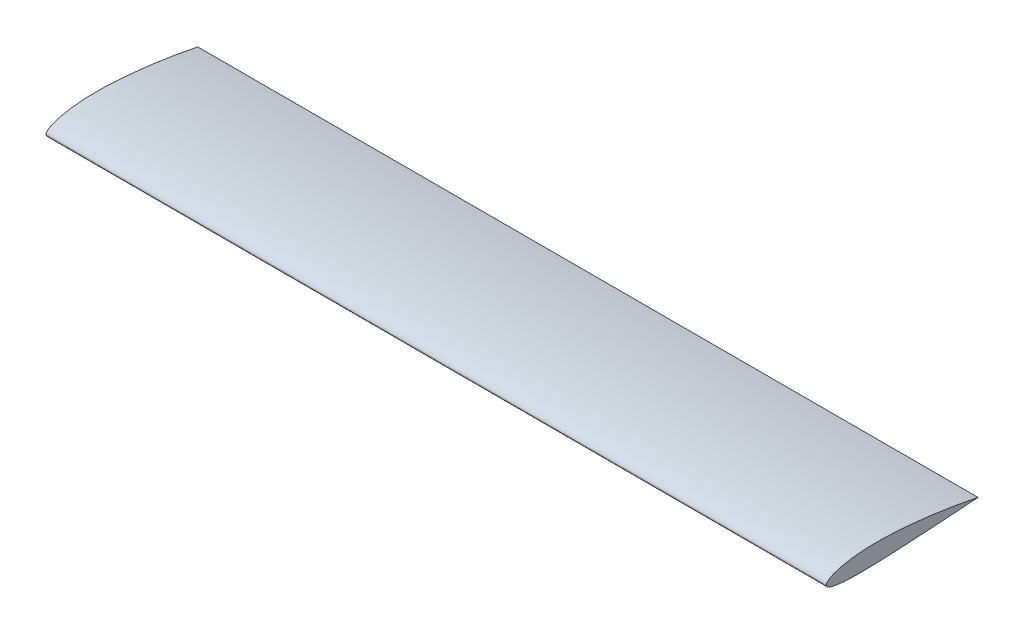
ISO-10303-21;
HEADER;
FILE_DESCRIPTION(('STEP AP214'),'2;1');
FILE_NAME('part.step','',(''),(''),'','','');
FILE_SCHEMA(('AUTOMOTIVE_DESIGN { 1 0 10303 214 1 1 1 1 }'));
ENDSEC;
DATA;
#1=APPLICATION_CONTEXT('core data for automotive mechanical design processes');
#2=APPLICATION_PROTOCOL_DEFINITION('international standard','automotive_design',2000,#1);
#3=PRODUCT_CONTEXT('',#1,'mechanical');
#4=PRODUCT('Part','Part','',(#3));
#5=PRODUCT_RELATED_PRODUCT_CATEGORY('part','',(#4));
#6=PRODUCT_DEFINITION_FORMATION('','',#4);
#7=PRODUCT_DEFINITION_CONTEXT('part definition',#1,'design');
#8=PRODUCT_DEFINITION('design','',#6,#7);
#9=PRODUCT_DEFINITION_SHAPE('','',#8);
#10=(LENGTH_UNIT() NAMED_UNIT(*) SI_UNIT(.MILLI.,.METRE.));
#11=(NAMED_UNIT(*) PLANE_ANGLE_UNIT() SI_UNIT($,.RADIAN.));
#12=(NAMED_UNIT(*) SI_UNIT($,.STERADIAN.) SOLID_ANGLE_UNIT());
#13=UNCERTAINTY_MEASURE_WITH_UNIT(LENGTH_MEASURE(1.E-05),#10,'distance_accuracy_value','');
#14=(GEOMETRIC_REPRESENTATION_CONTEXT(3) GLOBAL_UNCERTAINTY_ASSIGNED_CONTEXT((#13)) GLOBAL_UNIT_ASSIGNED_CONTEXT((#10,
#11,#12)) REPRESENTATION_CONTEXT('',''));
#15=CARTESIAN_POINT('',(0.,0.,0.));
#16=DIRECTION('',(0.,0.,1.));
#17=DIRECTION('',(1.,0.,0.));
#18=AXIS2_PLACEMENT_3D('',#15,#16,#17);
#19=CARTESIAN_POINT('',(914.4,0.0889253932627242,-355.701595777223));
#20=CARTESIAN_POINT('',(914.4,0.484624005626237,-353.820982462157));
#21=CARTESIAN_POINT('',(914.4,1.27535851285372,-350.06290549016));
#22=CARTESIAN_POINT('',(914.4,2.40896211209541,-344.419734734437));
#23=CARTESIAN_POINT('',(914.4,3.51324778391415,-338.780435345257));
#24=CARTESIAN_POINT('',(914.4,4.58909678290494,-333.145393936357));
#25=CARTESIAN_POINT('',(914.4,5.64104392118993,-327.516243033246));
#26=CARTESIAN_POINT('',(914.4,6.67076334893902,-321.89427826569));
#27=CARTESIAN_POINT('',(914.4,8.01367406287168,-314.418943592819));
#28=CARTESIAN_POINT('',(914.4,9.96126798536939,-303.256989976563));
#29=CARTESIAN_POINT('',(914.4,12.1108173219839,-290.277200014141));
#30=CARTESIAN_POINT('',(914.4,14.122782619332,-277.368997406491));
#31=CARTESIAN_POINT('',(914.4,15.7436479641919,-266.403335807813));
#32=CARTESIAN_POINT('',(914.4,17.7585168755262,-251.979265272355));
#33=CARTESIAN_POINT('',(914.4,19.5838322129948,-237.688697541121));
#34=CARTESIAN_POINT('',(914.4,21.2272662135366,-223.548423889299));
#35=CARTESIAN_POINT('',(914.4,22.3588331538437,-213.140838664397));
#36=CARTESIAN_POINT('',(914.4,23.3974603272466,-202.876901813657));
#37=CARTESIAN_POINT('',(914.4,24.3421730512076,-192.766904587782));
#38=CARTESIAN_POINT('',(914.4,25.1903532405106,-182.820991555154));
#39=CARTESIAN_POINT('',(914.4,25.9380469996407,-173.049135462016));
#40=CARTESIAN_POINT('',(914.4,26.6835966119662,-161.921753843773));
#41=CARTESIAN_POINT('',(914.4,27.3539321127589,-149.534416124886));
#42=CARTESIAN_POINT('',(914.4,27.8483543086574,-135.989652302967));
#43=CARTESIAN_POINT('',(914.4,28.0679086064713,-122.941979988073));
#44=CARTESIAN_POINT('',(914.4,28.0086345154162,-110.421097293716));
#45=CARTESIAN_POINT('',(914.4,27.7088999202693,-99.7006857119303));
#46=CARTESIAN_POINT('',(914.4,27.2700820257867,-90.6938771166426));
#47=CARTESIAN_POINT('',(914.4,26.7835078373746,-83.3037872615764));
#48=CARTESIAN_POINT('',(914.4,26.18856569507,-76.1879411970467));
#49=CARTESIAN_POINT('',(914.4,25.4909327318441,-69.3535084959214));
#50=CARTESIAN_POINT('',(914.4,24.6967255322864,-62.8073647159363));
#51=CARTESIAN_POINT('',(914.4,23.8123591340536,-56.5560704498389));
#52=CARTESIAN_POINT('',(914.4,22.8444357639212,-50.605888598608));
#53=CARTESIAN_POINT('',(914.4,21.7997261891463,-44.9627953756842));
#54=CARTESIAN_POINT('',(914.4,20.685186913535,-39.6324332304572));
#55=CARTESIAN_POINT('',(914.4,19.6899031865281,-35.3947077953518));
#56=CARTESIAN_POINT('',(914.4,18.6716777589547,-31.4198169285038));
#57=CARTESIAN_POINT('',(914.4,17.8331975255804,-28.4021491122697));
#58=CARTESIAN_POINT('',(914.4,16.9555938798481,-25.5014488404443));
#59=CARTESIAN_POINT('',(914.4,16.298147069041,-23.4453784809647));
#60=CARTESIAN_POINT('',(914.4,15.6313806019597,-21.4729134756898));
#61=CARTESIAN_POINT('',(914.4,14.9561847144711,-19.5845466871975));
#62=CARTESIAN_POINT('',(914.4,14.2734428652302,-17.7807433672908));
#63=CARTESIAN_POINT('',(914.4,13.584002756826,-16.0619506098679));
#64=CARTESIAN_POINT('',(914.4,12.8886919428141,-14.428587512137));
#65=CARTESIAN_POINT('',(914.4,12.1883033788525,-12.8810498245961));
#66=CARTESIAN_POINT('',(914.4,11.483573229761,-11.4197160743329));
#67=CARTESIAN_POINT('',(914.4,10.7752181864561,-10.0449253383934));
#68=CARTESIAN_POINT('',(914.4,10.0638586207156,-8.75701269761726));
#69=CARTESIAN_POINT('',(914.4,9.35009655675508,-7.55626573175894));
#70=CARTESIAN_POINT('',(914.4,8.63444285287984,-6.44296018261714));
#71=CARTESIAN_POINT('',(914.4,7.91734117789115,-5.417340410308));
#72=CARTESIAN_POINT('',(914.4,7.19916357779563,-4.47962543599811));
#73=CARTESIAN_POINT('',(914.4,6.48019494382984,-3.63001334273282));
#74=CARTESIAN_POINT('',(914.4,5.76063710077306,-2.86868395124196));
#75=CARTESIAN_POINT('',(914.4,5.04059121770292,-2.195817362075));
#76=CARTESIAN_POINT('',(914.4,4.32007898139228,-1.61159381898603));
#77=CARTESIAN_POINT('',(914.4,3.59903281122039,-1.11624014767135));
#78=CARTESIAN_POINT('',(914.4,2.87733118939277,-0.710028114604896));
#79=CARTESIAN_POINT('',(914.4,2.15485320604866,-0.39338363413053));
#80=CARTESIAN_POINT('',(914.4,1.4315553118171,-0.1665518263494));
#81=CARTESIAN_POINT('',(914.4,0.707533425580991,-0.030746426146179));
#82=CARTESIAN_POINT('',(914.4,0.00232999172516989,0.0151141269265284));
#83=CARTESIAN_POINT('',(914.4,-0.683410252458762,-0.0301123127008363));
#84=CARTESIAN_POINT('',(914.4,-1.34734443272399,-0.166804927892485));
#85=CARTESIAN_POINT('',(914.4,-2.00629597834685,-0.393412573656049));
#86=CARTESIAN_POINT('',(914.4,-2.65806295550882,-0.710184902967793));
#87=CARTESIAN_POINT('',(914.4,-3.3007051728757,-1.11650023701077));
#88=CARTESIAN_POINT('',(914.4,-3.93248835778129,-1.61204408104538));
#89=CARTESIAN_POINT('',(914.4,-4.55184121576959,-2.19651415591684));
#90=CARTESIAN_POINT('',(914.4,-5.15734655079039,-2.86967326761789));
#91=CARTESIAN_POINT('',(914.4,-5.74771380904876,-3.63132174644053));
#92=CARTESIAN_POINT('',(914.4,-6.32179472820847,-4.48127028019185));
#93=CARTESIAN_POINT('',(914.4,-6.87858273078217,-5.41932635684943));
#94=CARTESIAN_POINT('',(914.4,-7.41723678418927,-6.44528145917194));
#95=CARTESIAN_POINT('',(914.4,-7.9370770427937,-7.5589053978846));
#96=CARTESIAN_POINT('',(914.4,-8.43757231319527,-8.75995273030753));
#97=CARTESIAN_POINT('',(914.4,-8.91836583840254,-10.0481428176997));
#98=CARTESIAN_POINT('',(914.4,-9.37922340329618,-11.4231811653722));
#99=CARTESIAN_POINT('',(914.4,-9.82008394739048,-12.8847368005442));
#100=CARTESIAN_POINT('',(914.4,-10.2409737200924,-14.4324650671531));
#101=CARTESIAN_POINT('',(914.4,-10.6420485483224,-16.0659905054996));
#102=CARTESIAN_POINT('',(914.4,-11.0235398585687,-17.7849173246149));
#103=CARTESIAN_POINT('',(914.4,-11.3857556510677,-19.5888253580915));
#104=CARTESIAN_POINT('',(914.4,-11.7290406571282,-21.477272813935));
#105=CARTESIAN_POINT('',(914.4,-12.0537703853528,-23.4497947246867));
#106=CARTESIAN_POINT('',(914.4,-12.3603485411018,-25.505901176546));
#107=CARTESIAN_POINT('',(914.4,-12.649154465565,-27.645083135526));
#108=CARTESIAN_POINT('',(914.4,-12.9205541563609,-29.8668090123672));
#109=CARTESIAN_POINT('',(914.4,-13.1748849579276,-32.1705261215346));
#110=CARTESIAN_POINT('',(914.4,-13.4968263810214,-35.4029841202578));
#111=CARTESIAN_POINT('',(914.4,-13.8550848322599,-39.6448393525124));
#112=CARTESIAN_POINT('',(914.4,-14.2139935042342,-44.9745265085033));
#113=CARTESIAN_POINT('',(914.4,-14.5090457108774,-50.61688962595));
#114=CARTESIAN_POINT('',(914.4,-14.7402590737874,-56.5663122805725));
#115=CARTESIAN_POINT('',(914.4,-14.9074730332073,-62.8168312265205));
#116=CARTESIAN_POINT('',(914.4,-15.0107101123562,-69.3621813340048));
#117=CARTESIAN_POINT('',(914.4,-15.0505930960723,-76.1957883281505));
#118=CARTESIAN_POINT('',(914.4,-15.0286262975969,-83.3107634479092));
#119=CARTESIAN_POINT('',(914.4,-14.9474016550117,-90.699932795799));
#120=CARTESIAN_POINT('',(914.4,-14.810550774888,-98.3558542198881));
#121=CARTESIAN_POINT('',(914.4,-14.6225350123151,-106.270843080503));
#122=CARTESIAN_POINT('',(914.4,-14.3882679843999,-114.436948340336));
#123=CARTESIAN_POINT('',(914.4,-14.1126194201521,-122.845962319884));
#124=CARTESIAN_POINT('',(914.4,-13.7998317357183,-131.489439579796));
#125=CARTESIAN_POINT('',(914.4,-13.4530819109173,-140.358695433699));
#126=CARTESIAN_POINT('',(914.4,-13.0740718908004,-149.444813068628));
#127=CARTESIAN_POINT('',(914.4,-12.5200820406814,-161.967501199821));
#128=CARTESIAN_POINT('',(914.4,-11.9045597122844,-174.747578342092));
#129=CARTESIAN_POINT('',(914.4,-11.2203138831552,-187.771766741251));
#130=CARTESIAN_POINT('',(914.4,-10.662647688894,-197.800794715792));
#131=CARTESIAN_POINT('',(914.4,-10.0652216082825,-207.98875411901));
#132=CARTESIAN_POINT('',(914.4,-9.32187027297732,-220.088376156645));
#133=CARTESIAN_POINT('',(914.4,-8.53301058673014,-232.34561908973));
#134=CARTESIAN_POINT('',(914.4,-7.71491706996906,-244.748617509708));
#135=CARTESIAN_POINT('',(914.4,-6.99893122512161,-255.522811479558));
#136=CARTESIAN_POINT('',(914.4,-6.39934038681402,-264.566391870286));
#137=CARTESIAN_POINT('',(914.4,-5.79786412874415,-273.687256464813));
#138=CARTESIAN_POINT('',(914.4,-5.1951200497201,-282.876251389806));
#139=CARTESIAN_POINT('',(914.4,-4.46877871232969,-293.955974154125));
#140=CARTESIAN_POINT('',(914.4,-3.85199027603764,-303.229665611719));
#141=CARTESIAN_POINT('',(914.4,-3.34406333342293,-310.676673640107));
#142=CARTESIAN_POINT('',(914.4,-2.95388108489374,-316.280044555267));
#143=CARTESIAN_POINT('',(914.4,-2.55381249700848,-321.893308292669));
#144=CARTESIAN_POINT('',(914.4,-2.14364169031469,-327.515028548356));
#145=CARTESIAN_POINT('',(914.4,-1.7247607287393,-333.143759917849));
#146=CARTESIAN_POINT('',(914.4,-1.30028039522665,-338.778048968654));
#147=CARTESIAN_POINT('',(914.4,-0.877833024389936,-344.416501854525));
#148=CARTESIAN_POINT('',(914.4,-0.463361083633877,-350.057427869166));
#149=CARTESIAN_POINT('',(914.4,-0.213733561449226,-353.820268309212));
#150=CARTESIAN_POINT('',(914.4,-0.088925393262724,-355.701604222777));
#151=B_SPLINE_CURVE_WITH_KNOTS('',3,(#19,#20,#21,#22,#23,#24,#25,#26,#27,#28,#29,#30,#31,#32,
#33,#34,#35,#36,#37,#38,#39,#40,#41,#42,#43,#44,#45,#46,#47,#48,#49,#50,#51,#52,#53,#54,#55,#56,
#57,#58,#59,#60,#61,#62,#63,#64,#65,#66,#67,#68,#69,#70,#71,#72,#73,#74,#75,#76,#77,#78,#79,#80,
#81,#82,#83,#84,#85,#86,#87,#88,#89,#90,#91,#92,#93,#94,#95,#96,#97,#98,#99,#100,#101,#102,#103,
#104,#105,#106,#107,#108,#109,#110,#111,#112,#113,#114,#115,#116,#117,#118,#119,#120,#121,#122,
#123,#124,#125,#126,#127,#128,#129,#130,#131,#132,#133,#134,#135,#136,#137,#138,#139,#140,#141,
#142,#143,#144,#145,#146,#147,#148,#149,#150),.UNSPECIFIED.,.F.,.F.,(4,1,1,1,1,1,1,1,1,1,1,1,1,
1,1,1,1,1,1,1,1,1,1,1,1,1,1,1,1,1,1,1,1,1,1,1,1,1,1,1,1,1,1,1,1,1,1,1,1,1,1,1,1,1,1,1,1,1,1,1,1,
1,1,1,1,1,1,1,1,1,1,1,1,1,1,1,1,1,1,1,1,1,1,1,1,1,1,1,1,1,1,1,1,1,1,1,1,1,1,1,1,1,1,1,1,1,1,1,1,
1,1,1,1,1,1,1,1,1,1,1,1,1,1,1,1,1,1,1,1,4),(0.,0.00794054253800827,0.0158677862260044,
0.0237823355295012,0.0316838418205309,0.0395714657177212,0.0474438053438306,0.0552994066495223,
0.0709529074253012,0.0942599656642179,0.109659748759335,0.124931367508802,0.140060474948947,
0.16983616684281,0.184455938035171,0.198878987847676,0.213091980808253,0.227081363790371,
0.24083373334847,0.254335896346066,0.267574897796778,0.286913018185408,0.305591757157393,
0.323574750969682,0.340828861994365,0.357323531066317,0.367884026456488,0.378086461731641,
0.387923234082839,0.397387015236196,0.406470797189749,0.415167950389097,0.423472243631592,
0.431377770088885,0.438879021724844,0.445971138884747,0.449362330648294,0.455832514431191,
0.458910652184174,0.461883669269834,0.464751272019807,0.467513247226822,0.470169459050699,
0.472719871771161,0.475164566874604,0.477503761569343,0.479737826283505,0.48186733255789,
0.483893083712124,0.485816151684372,0.487637951221375,0.489360302772708,0.490985530021076,
0.492516542176065,0.49395700356015,0.495311466006948,0.496585560552849,0.497786200428971,
0.49892178695692,0.500002352220144,0.501039639811119,0.502046986670077,0.503038994908549,
0.503951730837978,0.504878158030601,0.505831392661311,0.506823575724639,0.507865603008109,
0.508967031971782,0.510136106550442,0.511379884791428,0.512704371017619,0.514114660263003,
0.51561509311769,0.517209348446535,0.518900571097045,0.520691418544469,0.52258414386721,
0.524580637882838,0.526682477749363,0.528890963833217,0.531207133212725,0.533631806027993,
0.536165598839476,0.538808937253662,0.541562081086993,0.544425146730385,0.54739810801092,
0.550480817074069,0.553673026528163,0.556974385201834,0.563902733135108,0.571261380888569,
0.579045037483656,0.587247420068503,0.595861594725327,0.604880098032451,0.614294871054451,
0.624097260748233,0.634278055645911,0.644827521987638,0.655735355300336,0.666990798757914,
0.678582536023013,0.690498842724987,0.702727788654271,0.715257041549763,0.728074047062697,
0.75452037740322,0.768123570697866,0.781962351074077,0.79602290449003,0.810291084820141,
0.832050541345135,0.84677287440772,0.861649926398845,0.876666218949297,0.884221742698137,
0.899417940676313,0.914715475207486,0.930099899620206,0.937820202466263,0.94555696886631,
0.953308312238934,0.961072258877045,0.96884687873477,0.976629764477321,0.984418333857866,
0.992209516036237,1.),.UNSPECIFIED.);
#152=DIRECTION('',(-1.,0.,0.));
#153=VECTOR('',#152,1.);
#154=SURFACE_OF_LINEAR_EXTRUSION('',#151,#153);
#155=CARTESIAN_POINT('',(-914.4,0.0889253932627242,-355.701595777223));
#156=CARTESIAN_POINT('',(-914.4,0.484624005626237,-353.820982462157));
#157=CARTESIAN_POINT('',(-914.4,1.27535851285372,-350.06290549016));
#158=CARTESIAN_POINT('',(-914.4,2.40896211209541,-344.419734734437));
#159=CARTESIAN_POINT('',(-914.4,3.51324778391415,-338.780435345257));
#160=CARTESIAN_POINT('',(-914.4,4.58909678290494,-333.145393936357));
#161=CARTESIAN_POINT('',(-914.4,5.64104392118993,-327.516243033246));
#162=CARTESIAN_POINT('',(-914.4,6.67076334893902,-321.89427826569));
#163=CARTESIAN_POINT('',(-914.4,8.01367406287168,-314.418943592819));
#164=CARTESIAN_POINT('',(-914.4,9.96126798536939,-303.256989976563));
#165=CARTESIAN_POINT('',(-914.4,12.1108173219839,-290.277200014141));
#166=CARTESIAN_POINT('',(-914.4,14.122782619332,-277.368997406491));
#167=CARTESIAN_POINT('',(-914.4,15.7436479641919,-266.403335807813));
#168=CARTESIAN_POINT('',(-914.4,17.7585168755262,-251.979265272355));
#169=CARTESIAN_POINT('',(-914.4,19.5838322129948,-237.688697541121));
#170=CARTESIAN_POINT('',(-914.4,21.2272662135366,-223.548423889299));
#171=CARTESIAN_POINT('',(-914.4,22.3588331538437,-213.140838664397));
#172=CARTESIAN_POINT('',(-914.4,23.3974603272466,-202.876901813657));
#173=CARTESIAN_POINT('',(-914.4,24.3421730512076,-192.766904587782));
#174=CARTESIAN_POINT('',(-914.4,25.1903532405106,-182.820991555154));
#175=CARTESIAN_POINT('',(-914.4,25.9380469996407,-173.049135462016));
#176=CARTESIAN_POINT('',(-914.4,26.6835966119662,-161.921753843773));
#177=CARTESIAN_POINT('',(-914.4,27.3539321127589,-149.534416124886));
#178=CARTESIAN_POINT('',(-914.4,27.8483543086574,-135.989652302967));
#179=CARTESIAN_POINT('',(-914.4,28.0679086064713,-122.941979988073));
#180=CARTESIAN_POINT('',(-914.4,28.0086345154162,-110.421097293716));
#181=CARTESIAN_POINT('',(-914.4,27.7088999202693,-99.7006857119303));
#182=CARTESIAN_POINT('',(-914.4,27.2700820257867,-90.6938771166426));
#183=CARTESIAN_POINT('',(-914.4,26.7835078373746,-83.3037872615764));
#184=CARTESIAN_POINT('',(-914.4,26.18856569507,-76.1879411970467));
#185=CARTESIAN_POINT('',(-914.4,25.4909327318441,-69.3535084959214));
#186=CARTESIAN_POINT('',(-914.4,24.6967255322864,-62.8073647159363));
#187=CARTESIAN_POINT('',(-914.4,23.8123591340536,-56.5560704498389));
#188=CARTESIAN_POINT('',(-914.4,22.8444357639212,-50.605888598608));
#189=CARTESIAN_POINT('',(-914.4,21.7997261891463,-44.9627953756842));
#190=CARTESIAN_POINT('',(-914.4,20.685186913535,-39.6324332304572));
#191=CARTESIAN_POINT('',(-914.4,19.6899031865281,-35.3947077953518));
#192=CARTESIAN_POINT('',(-914.4,18.6716777589547,-31.4198169285038));
#193=CARTESIAN_POINT('',(-914.4,17.8331975255804,-28.4021491122697));
#194=CARTESIAN_POINT('',(-914.4,16.9555938798481,-25.5014488404443));
#195=CARTESIAN_POINT('',(-914.4,16.298147069041,-23.4453784809647));
#196=CARTESIAN_POINT('',(-914.4,15.6313806019597,-21.4729134756898));
#197=CARTESIAN_POINT('',(-914.4,14.9561847144711,-19.5845466871975));
#198=CARTESIAN_POINT('',(-914.4,14.2734428652302,-17.7807433672908));
#199=CARTESIAN_POINT('',(-914.4,13.584002756826,-16.0619506098679));
#200=CARTESIAN_POINT('',(-914.4,12.8886919428141,-14.428587512137));
#201=CARTESIAN_POINT('',(-914.4,12.1883033788525,-12.8810498245961));
#202=CARTESIAN_POINT('',(-914.4,11.483573229761,-11.4197160743329));
#203=CARTESIAN_POINT('',(-914.4,10.7752181864561,-10.0449253383934));
#204=CARTESIAN_POINT('',(-914.4,10.0638586207156,-8.75701269761726));
#205=CARTESIAN_POINT('',(-914.4,9.35009655675508,-7.55626573175894));
#206=CARTESIAN_POINT('',(-914.4,8.63444285287984,-6.44296018261714));
#207=CARTESIAN_POINT('',(-914.4,7.91734117789115,-5.417340410308));
#208=CARTESIAN_POINT('',(-914.4,7.19916357779563,-4.47962543599811));
#209=CARTESIAN_POINT('',(-914.4,6.48019494382984,-3.63001334273282));
#210=CARTESIAN_POINT('',(-914.4,5.76063710077306,-2.86868395124196));
#211=CARTESIAN_POINT('',(-914.4,5.04059121770292,-2.195817362075));
#212=CARTESIAN_POINT('',(-914.4,4.32007898139228,-1.61159381898603));
#213=CARTESIAN_POINT('',(-914.4,3.59903281122039,-1.11624014767135));
#214=CARTESIAN_POINT('',(-914.4,2.87733118939277,-0.710028114604896));
#215=CARTESIAN_POINT('',(-914.4,2.15485320604866,-0.39338363413053));
#216=CARTESIAN_POINT('',(-914.4,1.4315553118171,-0.1665518263494));
#217=CARTESIAN_POINT('',(-914.4,0.707533425580991,-0.030746426146179));
#218=CARTESIAN_POINT('',(-914.4,0.00232999172516989,0.0151141269265284));
#219=CARTESIAN_POINT('',(-914.4,-0.683410252458762,-0.0301123127008363));
#220=CARTESIAN_POINT('',(-914.4,-1.34734443272399,-0.166804927892485));
#221=CARTESIAN_POINT('',(-914.4,-2.00629597834685,-0.393412573656049));
#222=CARTESIAN_POINT('',(-914.4,-2.65806295550882,-0.710184902967793));
#223=CARTESIAN_POINT('',(-914.4,-3.3007051728757,-1.11650023701077));
#224=CARTESIAN_POINT('',(-914.4,-3.93248835778129,-1.61204408104538));
#225=CARTESIAN_POINT('',(-914.4,-4.55184121576959,-2.19651415591684));
#226=CARTESIAN_POINT('',(-914.4,-5.15734655079039,-2.86967326761789));
#227=CARTESIAN_POINT('',(-914.4,-5.74771380904876,-3.63132174644053));
#228=CARTESIAN_POINT('',(-914.4,-6.32179472820847,-4.48127028019185));
#229=CARTESIAN_POINT('',(-914.4,-6.87858273078217,-5.41932635684943));
#230=CARTESIAN_POINT('',(-914.4,-7.41723678418927,-6.44528145917194));
#231=CARTESIAN_POINT('',(-914.4,-7.9370770427937,-7.5589053978846));
#232=CARTESIAN_POINT('',(-914.4,-8.43757231319527,-8.75995273030753));
#233=CARTESIAN_POINT('',(-914.4,-8.91836583840254,-10.0481428176997));
#234=CARTESIAN_POINT('',(-914.4,-9.37922340329618,-11.4231811653722));
#235=CARTESIAN_POINT('',(-914.4,-9.82008394739048,-12.8847368005442));
#236=CARTESIAN_POINT('',(-914.4,-10.2409737200924,-14.4324650671531));
#237=CARTESIAN_POINT('',(-914.4,-10.6420485483224,-16.0659905054996));
#238=CARTESIAN_POINT('',(-914.4,-11.0235398585687,-17.7849173246149));
#239=CARTESIAN_POINT('',(-914.4,-11.3857556510677,-19.5888253580915));
#240=CARTESIAN_POINT('',(-914.4,-11.7290406571282,-21.477272813935));
#241=CARTESIAN_POINT('',(-914.4,-12.0537703853528,-23.4497947246867));
#242=CARTESIAN_POINT('',(-914.4,-12.3603485411018,-25.505901176546));
#243=CARTESIAN_POINT('',(-914.4,-12.649154465565,-27.645083135526));
#244=CARTESIAN_POINT('',(-914.4,-12.9205541563609,-29.8668090123672));
#245=CARTESIAN_POINT('',(-914.4,-13.1748849579276,-32.1705261215346));
#246=CARTESIAN_POINT('',(-914.4,-13.4968263810214,-35.4029841202578));
#247=CARTESIAN_POINT('',(-914.4,-13.8550848322599,-39.6448393525124));
#248=CARTESIAN_POINT('',(-914.4,-14.2139935042342,-44.9745265085033));
#249=CARTESIAN_POINT('',(-914.4,-14.5090457108774,-50.61688962595));
#250=CARTESIAN_POINT('',(-914.4,-14.7402590737874,-56.5663122805725));
#251=CARTESIAN_POINT('',(-914.4,-14.9074730332073,-62.8168312265205));
#252=CARTESIAN_POINT('',(-914.4,-15.0107101123562,-69.3621813340048));
#253=CARTESIAN_POINT('',(-914.4,-15.0505930960723,-76.1957883281505));
#254=CARTESIAN_POINT('',(-914.4,-15.0286262975969,-83.3107634479092));
#255=CARTESIAN_POINT('',(-914.4,-14.9474016550117,-90.699932795799));
#256=CARTESIAN_POINT('',(-914.4,-14.810550774888,-98.3558542198881));
#257=CARTESIAN_POINT('',(-914.4,-14.6225350123151,-106.270843080503));
#258=CARTESIAN_POINT('',(-914.4,-14.3882679843999,-114.436948340336));
#259=CARTESIAN_POINT('',(-914.4,-14.1126194201521,-122.845962319884));
#260=CARTESIAN_POINT('',(-914.4,-13.7998317357183,-131.489439579796));
#261=CARTESIAN_POINT('',(-914.4,-13.4530819109173,-140.358695433699));
#262=CARTESIAN_POINT('',(-914.4,-13.0740718908004,-149.444813068628));
#263=CARTESIAN_POINT('',(-914.4,-12.5200820406814,-161.967501199821));
#264=CARTESIAN_POINT('',(-914.4,-11.9045597122844,-174.747578342092));
#265=CARTESIAN_POINT('',(-914.4,-11.2203138831552,-187.771766741251));
#266=CARTESIAN_POINT('',(-914.4,-10.662647688894,-197.800794715792));
#267=CARTESIAN_POINT('',(-914.4,-10.0652216082825,-207.98875411901));
#268=CARTESIAN_POINT('',(-914.4,-9.32187027297732,-220.088376156645));
#269=CARTESIAN_POINT('',(-914.4,-8.53301058673014,-232.34561908973));
#270=CARTESIAN_POINT('',(-914.4,-7.71491706996906,-244.748617509708));
#271=CARTESIAN_POINT('',(-914.4,-6.99893122512161,-255.522811479558));
#272=CARTESIAN_POINT('',(-914.4,-6.39934038681402,-264.566391870286));
#273=CARTESIAN_POINT('',(-914.4,-5.79786412874415,-273.687256464813));
#274=CARTESIAN_POINT('',(-914.4,-5.1951200497201,-282.876251389806));
#275=CARTESIAN_POINT('',(-914.4,-4.46877871232969,-293.955974154125));
#276=CARTESIAN_POINT('',(-914.4,-3.85199027603764,-303.229665611719));
#277=CARTESIAN_POINT('',(-914.4,-3.34406333342293,-310.676673640107));
#278=CARTESIAN_POINT('',(-914.4,-2.95388108489374,-316.280044555267));
#279=CARTESIAN_POINT('',(-914.4,-2.55381249700848,-321.893308292669));
#280=CARTESIAN_POINT('',(-914.4,-2.14364169031469,-327.515028548356));
#281=CARTESIAN_POINT('',(-914.4,-1.7247607287393,-333.143759917849));
#282=CARTESIAN_POINT('',(-914.4,-1.30028039522665,-338.778048968654));
#283=CARTESIAN_POINT('',(-914.4,-0.877833024389936,-344.416501854525));
#284=CARTESIAN_POINT('',(-914.4,-0.463361083633877,-350.057427869166));
#285=CARTESIAN_POINT('',(-914.4,-0.213733561449226,-353.820268309212));
#286=CARTESIAN_POINT('',(-914.4,-0.088925393262724,-355.701604222777));
#287=B_SPLINE_CURVE_WITH_KNOTS('',3,(#155,#156,#157,#158,#159,#160,#161,#162,#163,#164,#165,
#166,#167,#168,#169,#170,#171,#172,#173,#174,#175,#176,#177,#178,#179,#180,#181,#182,#183,#184,
#185,#186,#187,#188,#189,#190,#191,#192,#193,#194,#195,#196,#197,#198,#199,#200,#201,#202,#203,
#204,#205,#206,#207,#208,#209,#210,#211,#212,#213,#214,#215,#216,#217,#218,#219,#220,#221,#222,
#223,#224,#225,#226,#227,#228,#229,#230,#231,#232,#233,#234,#235,#236,#237,#238,#239,#240,#241,
#242,#243,#244,#245,#246,#247,#248,#249,#250,#251,#252,#253,#254,#255,#256,#257,#258,#259,#260,
#261,#262,#263,#264,#265,#266,#267,#268,#269,#270,#271,#272,#273,#274,#275,#276,#277,#278,#279,
#280,#281,#282,#283,#284,#285,#286),.UNSPECIFIED.,.F.,.F.,(4,1,1,1,1,1,1,1,1,1,1,1,1,1,1,1,1,1,
1,1,1,1,1,1,1,1,1,1,1,1,1,1,1,1,1,1,1,1,1,1,1,1,1,1,1,1,1,1,1,1,1,1,1,1,1,1,1,1,1,1,1,1,1,1,1,1,
1,1,1,1,1,1,1,1,1,1,1,1,1,1,1,1,1,1,1,1,1,1,1,1,1,1,1,1,1,1,1,1,1,1,1,1,1,1,1,1,1,1,1,1,1,1,1,1,
1,1,1,1,1,1,1,1,1,1,1,1,1,1,1,4),(0.,0.00794054253800827,0.0158677862260044,0.0237823355295012,
0.0316838418205309,0.0395714657177212,0.0474438053438306,0.0552994066495223,0.0709529074253012,
0.0942599656642179,0.109659748759335,0.124931367508802,0.140060474948947,0.16983616684281,
0.184455938035171,0.198878987847676,0.213091980808253,0.227081363790371,0.24083373334847,
0.254335896346066,0.267574897796778,0.286913018185408,0.305591757157393,0.323574750969682,
0.340828861994365,0.357323531066317,0.367884026456488,0.378086461731641,0.387923234082839,
0.397387015236196,0.406470797189749,0.415167950389097,0.423472243631592,0.431377770088885,
0.438879021724844,0.445971138884747,0.449362330648294,0.455832514431191,0.458910652184174,
0.461883669269834,0.464751272019807,0.467513247226822,0.470169459050699,0.472719871771161,
0.475164566874604,0.477503761569343,0.479737826283505,0.48186733255789,0.483893083712124,
0.485816151684372,0.487637951221375,0.489360302772708,0.490985530021076,0.492516542176065,
0.49395700356015,0.495311466006948,0.496585560552849,0.497786200428971,0.49892178695692,
0.500002352220144,0.501039639811119,0.502046986670077,0.503038994908549,0.503951730837978,
0.504878158030601,0.505831392661311,0.506823575724639,0.507865603008109,0.508967031971782,
0.510136106550442,0.511379884791428,0.512704371017619,0.514114660263003,0.51561509311769,
0.517209348446535,0.518900571097045,0.520691418544469,0.52258414386721,0.524580637882838,
0.526682477749363,0.528890963833217,0.531207133212725,0.533631806027993,0.536165598839476,
0.538808937253662,0.541562081086993,0.544425146730385,0.54739810801092,0.550480817074069,
0.553673026528163,0.556974385201834,0.563902733135108,0.571261380888569,0.579045037483656,
0.587247420068503,0.595861594725327,0.604880098032451,0.614294871054451,0.624097260748233,
0.634278055645911,0.644827521987638,0.655735355300336,0.666990798757914,0.678582536023013,
0.690498842724987,0.702727788654271,0.715257041549763,0.728074047062697,0.75452037740322,
0.768123570697866,0.781962351074077,0.79602290449003,0.810291084820141,0.832050541345135,
0.84677287440772,0.861649926398845,0.876666218949297,0.884221742698137,0.899417940676313,
0.914715475207486,0.930099899620206,0.937820202466263,0.94555696886631,0.953308312238934,
0.961072258877045,0.96884687873477,0.976629764477321,0.984418333857866,0.992209516036237,1.),.UNSPECIFIED.);
#288=CARTESIAN_POINT('',(-914.4,0.088925393262724,-355.701595777223));
#289=VERTEX_POINT('',#288);
#290=CARTESIAN_POINT('',(-914.4,-0.0889253932627242,-355.701604222777));
#291=VERTEX_POINT('',#290);
#292=EDGE_CURVE('E79',#289,#291,#287,.T.);
#293=ORIENTED_EDGE('',*,*,#292,.T.);
#294=DIRECTION('',(-1.,0.,0.));
#295=VECTOR('',#294,1.);
#296=CARTESIAN_POINT('',(914.4,-0.0889253932627242,-355.701604222777));
#297=LINE('',#296,#295);
#298=CARTESIAN_POINT('',(914.4,-0.0889253932627242,-355.701604222777));
#299=VERTEX_POINT('',#298);
#300=EDGE_CURVE('E11',#299,#291,#297,.T.);
#301=ORIENTED_EDGE('',*,*,#300,.F.);
#302=CARTESIAN_POINT('',(914.4,0.088925393262724,-355.701595777223));
#303=VERTEX_POINT('',#302);
#304=EDGE_CURVE('E78',#303,#299,#151,.T.);
#305=ORIENTED_EDGE('',*,*,#304,.F.);
#306=DIRECTION('',(-1.,0.,0.));
#307=VECTOR('',#306,1.);
#308=CARTESIAN_POINT('',(914.4,0.088925393262724,-355.701595777223));
#309=LINE('',#308,#307);
#310=EDGE_CURVE('E55',#303,#289,#309,.T.);
#311=ORIENTED_EDGE('',*,*,#310,.T.);
#312=EDGE_LOOP('',(#293,#301,#305,#311));
#313=FACE_BOUND('',#312,.T.);
#314=ADVANCED_FACE('F45',(#313),#154,.F.);
#315=CARTESIAN_POINT('',(914.4,-0.0889253932627242,-355.701604222777));
#316=DIRECTION('',(0.,-4.74867373109869E-05,0.999999998872505));
#317=DIRECTION('',(0.,-0.999999998872505,-4.7486737310987E-05));
#318=AXIS2_PLACEMENT_3D('',#315,#316,#317);
#319=PLANE('',#318);
#320=DIRECTION('',(0.,0.999999998872505,4.7486737310987E-05));
#321=VECTOR('',#320,1.);
#322=CARTESIAN_POINT('',(-914.4,-0.0889253932627242,-355.701604222777));
#323=LINE('',#322,#321);
#324=EDGE_CURVE('E70',#291,#289,#323,.T.);
#325=ORIENTED_EDGE('',*,*,#324,.T.);
#326=ORIENTED_EDGE('',*,*,#310,.F.);
#327=DIRECTION('',(0.,0.999999998872505,4.7486737310987E-05));
#328=VECTOR('',#327,1.);
#329=CARTESIAN_POINT('',(914.4,-0.0889253932627242,-355.701604222777));
#330=LINE('',#329,#328);
#331=EDGE_CURVE('E62',#299,#303,#330,.T.);
#332=ORIENTED_EDGE('',*,*,#331,.F.);
#333=ORIENTED_EDGE('',*,*,#300,.T.);
#334=EDGE_LOOP('',(#325,#326,#332,#333));
#335=FACE_BOUND('',#334,.T.);
#336=ADVANCED_FACE('F73',(#335),#319,.F.);
#337=CARTESIAN_POINT('',(914.4,2.14167498648439,-0.403411722189331));
#338=DIRECTION('',(-1.,0.,0.));
#339=DIRECTION('',(0.,0.,1.));
#340=AXIS2_PLACEMENT_3D('',#337,#338,#339);
#341=PLANE('',#340);
#342=ORIENTED_EDGE('',*,*,#304,.T.);
#343=ORIENTED_EDGE('',*,*,#331,.T.);
#344=EDGE_LOOP('',(#342,#343));
#345=FACE_BOUND('',#344,.T.);
#346=ADVANCED_FACE('F100',(#345),#341,.F.);
#347=CARTESIAN_POINT('',(-914.4,2.14167498648439,-0.403411722189331));
#348=DIRECTION('',(-1.,0.,0.));
#349=DIRECTION('',(0.,0.,1.));
#350=AXIS2_PLACEMENT_3D('',#347,#348,#349);
#351=PLANE('',#350);
#352=ORIENTED_EDGE('',*,*,#292,.F.);
#353=ORIENTED_EDGE('',*,*,#324,.F.);
#354=EDGE_LOOP('',(#352,#353));
#355=FACE_BOUND('',#354,.T.);
#356=ADVANCED_FACE('F83',(#355),#351,.T.);
#357=CLOSED_SHELL('',(#314,#336,#346,#356));
#358=MANIFOLD_SOLID_BREP('B2',#357);
#359=ADVANCED_BREP_SHAPE_REPRESENTATION('',(#18,#358),#14);
#360=SHAPE_DEFINITION_REPRESENTATION(#9,#359);
ENDSEC;
END-ISO-10303-21;
